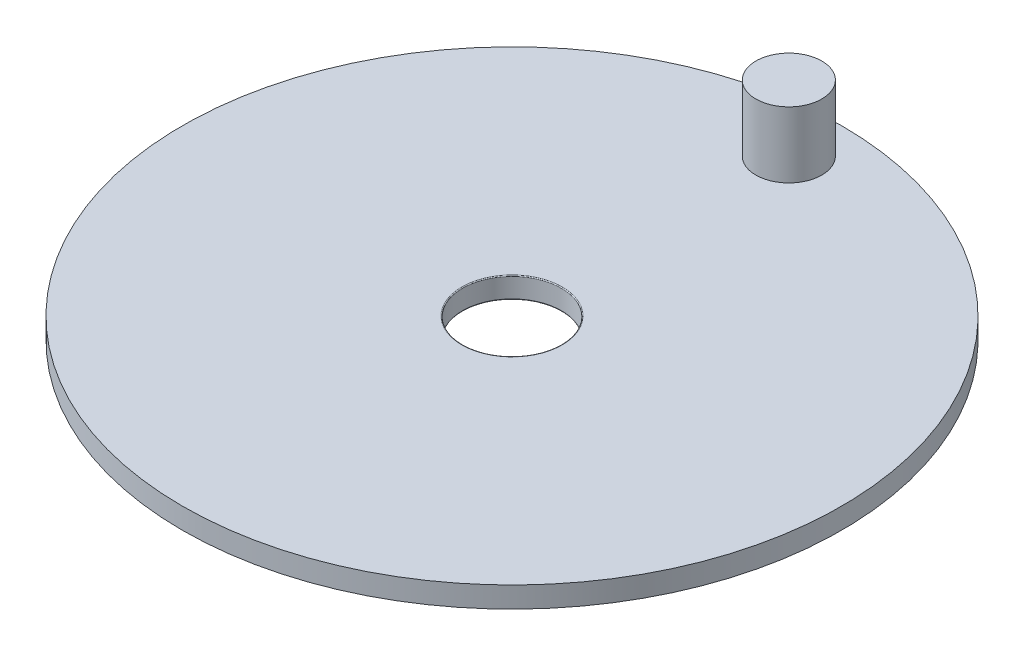
ISO-10303-21;
HEADER;
FILE_DESCRIPTION(('STEP AP214'),'2;1');
FILE_NAME('part.step','',(''),(''),'','','');
FILE_SCHEMA(('AUTOMOTIVE_DESIGN { 1 0 10303 214 1 1 1 1 }'));
ENDSEC;
DATA;
#1=APPLICATION_CONTEXT('core data for automotive mechanical design processes');
#2=APPLICATION_PROTOCOL_DEFINITION('international standard','automotive_design',2000,#1);
#3=PRODUCT_CONTEXT('',#1,'mechanical');
#4=PRODUCT('Part','Part','',(#3));
#5=PRODUCT_RELATED_PRODUCT_CATEGORY('part','',(#4));
#6=PRODUCT_DEFINITION_FORMATION('','',#4);
#7=PRODUCT_DEFINITION_CONTEXT('part definition',#1,'design');
#8=PRODUCT_DEFINITION('design','',#6,#7);
#9=PRODUCT_DEFINITION_SHAPE('','',#8);
#10=(LENGTH_UNIT() NAMED_UNIT(*) SI_UNIT(.MILLI.,.METRE.));
#11=(NAMED_UNIT(*) PLANE_ANGLE_UNIT() SI_UNIT($,.RADIAN.));
#12=(NAMED_UNIT(*) SI_UNIT($,.STERADIAN.) SOLID_ANGLE_UNIT());
#13=UNCERTAINTY_MEASURE_WITH_UNIT(LENGTH_MEASURE(1.E-05),#10,'distance_accuracy_value','');
#14=(GEOMETRIC_REPRESENTATION_CONTEXT(3) GLOBAL_UNCERTAINTY_ASSIGNED_CONTEXT((#13)) GLOBAL_UNIT_ASSIGNED_CONTEXT((#10,
#11,#12)) REPRESENTATION_CONTEXT('',''));
#15=CARTESIAN_POINT('',(0.,0.,0.));
#16=DIRECTION('',(0.,0.,1.));
#17=DIRECTION('',(1.,0.,0.));
#18=AXIS2_PLACEMENT_3D('',#15,#16,#17);
#19=CARTESIAN_POINT('',(0.,3.175,0.));
#20=DIRECTION('',(0.,-1.,0.));
#21=DIRECTION('',(0.,0.,-1.));
#22=AXIS2_PLACEMENT_3D('',#19,#20,#21);
#23=CYLINDRICAL_SURFACE('',#22,50.);
#24=CARTESIAN_POINT('',(0.,3.175,0.));
#25=DIRECTION('',(0.,1.,0.));
#26=DIRECTION('',(0.,0.,1.));
#27=AXIS2_PLACEMENT_3D('',#24,#25,#26);
#28=CIRCLE('',#27,50.);
#29=CARTESIAN_POINT('',(0.,3.175,50.));
#30=VERTEX_POINT('',#29);
#31=EDGE_CURVE('E59',#30,#30,#28,.T.);
#32=ORIENTED_EDGE('',*,*,#31,.F.);
#33=EDGE_LOOP('',(#32));
#34=FACE_BOUND('',#33,.T.);
#35=CARTESIAN_POINT('',(0.,0.,0.));
#36=DIRECTION('',(0.,1.,0.));
#37=DIRECTION('',(0.,0.,1.));
#38=AXIS2_PLACEMENT_3D('',#35,#36,#37);
#39=CIRCLE('',#38,50.);
#40=CARTESIAN_POINT('',(0.,0.,50.));
#41=VERTEX_POINT('',#40);
#42=EDGE_CURVE('E60',#41,#41,#39,.T.);
#43=ORIENTED_EDGE('',*,*,#42,.T.);
#44=EDGE_LOOP('',(#43));
#45=FACE_BOUND('',#44,.T.);
#46=ADVANCED_FACE('F39',(#34,#45),#23,.T.);
#47=CARTESIAN_POINT('',(0.,3.175,0.));
#48=DIRECTION('',(0.,1.,0.));
#49=DIRECTION('',(0.,0.,1.));
#50=AXIS2_PLACEMENT_3D('',#47,#48,#49);
#51=PLANE('',#50);
#52=CARTESIAN_POINT('',(0.,3.175,-42.));
#53=DIRECTION('',(0.,1.,0.));
#54=DIRECTION('',(0.,0.,1.));
#55=AXIS2_PLACEMENT_3D('',#52,#53,#54);
#56=CIRCLE('',#55,5.00000000000001);
#57=CARTESIAN_POINT('',(0.,3.175,-37.));
#58=VERTEX_POINT('',#57);
#59=EDGE_CURVE('E66',#58,#58,#56,.T.);
#60=ORIENTED_EDGE('',*,*,#59,.F.);
#61=EDGE_LOOP('',(#60));
#62=FACE_BOUND('',#61,.T.);
#63=CARTESIAN_POINT('',(0.,3.175,0.));
#64=DIRECTION('',(0.,1.,0.));
#65=DIRECTION('',(0.,0.,1.));
#66=AXIS2_PLACEMENT_3D('',#63,#64,#65);
#67=CIRCLE('',#66,7.627);
#68=CARTESIAN_POINT('',(0.,3.175,7.627));
#69=VERTEX_POINT('',#68);
#70=EDGE_CURVE('E10',#69,#69,#67,.F.);
#71=ORIENTED_EDGE('',*,*,#70,.T.);
#72=EDGE_LOOP('',(#71));
#73=FACE_BOUND('',#72,.T.);
#74=ORIENTED_EDGE('',*,*,#31,.T.);
#75=EDGE_LOOP('',(#74));
#76=FACE_BOUND('',#75,.T.);
#77=ADVANCED_FACE('F80',(#62,#73,#76),#51,.T.);
#78=CARTESIAN_POINT('',(0.,0.,0.));
#79=DIRECTION('',(0.,1.,0.));
#80=DIRECTION('',(0.,0.,1.));
#81=AXIS2_PLACEMENT_3D('',#78,#79,#80);
#82=PLANE('',#81);
#83=CARTESIAN_POINT('',(0.,0.,0.));
#84=DIRECTION('',(0.,1.,0.));
#85=DIRECTION('',(0.,0.,1.));
#86=AXIS2_PLACEMENT_3D('',#83,#84,#85);
#87=CIRCLE('',#86,7.627);
#88=CARTESIAN_POINT('',(0.,0.,7.627));
#89=VERTEX_POINT('',#88);
#90=EDGE_CURVE('E54',#89,#89,#87,.T.);
#91=ORIENTED_EDGE('',*,*,#90,.T.);
#92=EDGE_LOOP('',(#91));
#93=FACE_BOUND('',#92,.T.);
#94=ORIENTED_EDGE('',*,*,#42,.F.);
#95=EDGE_LOOP('',(#94));
#96=FACE_BOUND('',#95,.T.);
#97=ADVANCED_FACE('F82',(#93,#96),#82,.F.);
#98=CARTESIAN_POINT('',(0.,0.,0.));
#99=DIRECTION('',(0.,1.,0.));
#100=DIRECTION('',(0.,0.,1.));
#101=AXIS2_PLACEMENT_3D('',#98,#99,#100);
#102=CYLINDRICAL_SURFACE('',#101,7.5);
#103=CARTESIAN_POINT('',(0.,0.127,0.));
#104=DIRECTION('',(0.,1.,0.));
#105=DIRECTION('',(0.,0.,1.));
#106=AXIS2_PLACEMENT_3D('',#103,#104,#105);
#107=CIRCLE('',#106,7.5);
#108=CARTESIAN_POINT('',(0.,0.127,7.5));
#109=VERTEX_POINT('',#108);
#110=EDGE_CURVE('E46',#109,#109,#107,.F.);
#111=ORIENTED_EDGE('',*,*,#110,.T.);
#112=EDGE_LOOP('',(#111));
#113=FACE_BOUND('',#112,.T.);
#114=CARTESIAN_POINT('',(0.,3.048,0.));
#115=DIRECTION('',(0.,1.,0.));
#116=DIRECTION('',(0.,0.,1.));
#117=AXIS2_PLACEMENT_3D('',#114,#115,#116);
#118=CIRCLE('',#117,7.5);
#119=CARTESIAN_POINT('',(0.,3.048,7.5));
#120=VERTEX_POINT('',#119);
#121=EDGE_CURVE('E50',#120,#120,#118,.T.);
#122=ORIENTED_EDGE('',*,*,#121,.T.);
#123=EDGE_LOOP('',(#122));
#124=FACE_BOUND('',#123,.T.);
#125=ADVANCED_FACE('F93',(#113,#124),#102,.F.);
#126=CARTESIAN_POINT('',(0.,0.127,0.));
#127=DIRECTION('',(0.,1.,0.));
#128=DIRECTION('',(0.,0.,1.));
#129=AXIS2_PLACEMENT_3D('',#126,#127,#128);
#130=TOROIDAL_SURFACE('',#129,7.627,0.127);
#131=ORIENTED_EDGE('',*,*,#110,.F.);
#132=EDGE_LOOP('',(#131));
#133=FACE_BOUND('',#132,.T.);
#134=ORIENTED_EDGE('',*,*,#90,.F.);
#135=EDGE_LOOP('',(#134));
#136=FACE_BOUND('',#135,.T.);
#137=ADVANCED_FACE('F99',(#133,#136),#130,.T.);
#138=CARTESIAN_POINT('',(0.,3.048,0.));
#139=DIRECTION('',(0.,1.,0.));
#140=DIRECTION('',(0.,0.,1.));
#141=AXIS2_PLACEMENT_3D('',#138,#139,#140);
#142=TOROIDAL_SURFACE('',#141,7.627,0.127);
#143=ORIENTED_EDGE('',*,*,#70,.F.);
#144=EDGE_LOOP('',(#143));
#145=FACE_BOUND('',#144,.T.);
#146=ORIENTED_EDGE('',*,*,#121,.F.);
#147=EDGE_LOOP('',(#146));
#148=FACE_BOUND('',#147,.T.);
#149=ADVANCED_FACE('F41',(#145,#148),#142,.T.);
#150=CARTESIAN_POINT('',(0.,13.175,-42.));
#151=DIRECTION('',(0.,-1.,0.));
#152=DIRECTION('',(0.,0.,-1.));
#153=AXIS2_PLACEMENT_3D('',#150,#151,#152);
#154=CYLINDRICAL_SURFACE('',#153,5.00000000000001);
#155=CARTESIAN_POINT('',(0.,13.175,-42.));
#156=DIRECTION('',(0.,1.,0.));
#157=DIRECTION('',(0.,0.,1.));
#158=AXIS2_PLACEMENT_3D('',#155,#156,#157);
#159=CIRCLE('',#158,5.00000000000001);
#160=CARTESIAN_POINT('',(0.,13.175,-37.));
#161=VERTEX_POINT('',#160);
#162=EDGE_CURVE('E63',#161,#161,#159,.T.);
#163=ORIENTED_EDGE('',*,*,#162,.F.);
#164=EDGE_LOOP('',(#163));
#165=FACE_BOUND('',#164,.T.);
#166=ORIENTED_EDGE('',*,*,#59,.T.);
#167=EDGE_LOOP('',(#166));
#168=FACE_BOUND('',#167,.T.);
#169=ADVANCED_FACE('F74',(#165,#168),#154,.T.);
#170=CARTESIAN_POINT('',(0.,13.175,-42.));
#171=DIRECTION('',(0.,1.,0.));
#172=DIRECTION('',(0.,0.,1.));
#173=AXIS2_PLACEMENT_3D('',#170,#171,#172);
#174=PLANE('',#173);
#175=ORIENTED_EDGE('',*,*,#162,.T.);
#176=EDGE_LOOP('',(#175));
#177=FACE_BOUND('',#176,.T.);
#178=ADVANCED_FACE('F72',(#177),#174,.T.);
#179=CLOSED_SHELL('',(#46,#77,#97,#125,#137,#149,#169,#178));
#180=MANIFOLD_SOLID_BREP('B2',#179);
#181=ADVANCED_BREP_SHAPE_REPRESENTATION('',(#18,#180),#14);
#182=SHAPE_DEFINITION_REPRESENTATION(#9,#181);
ENDSEC;
END-ISO-10303-21;
